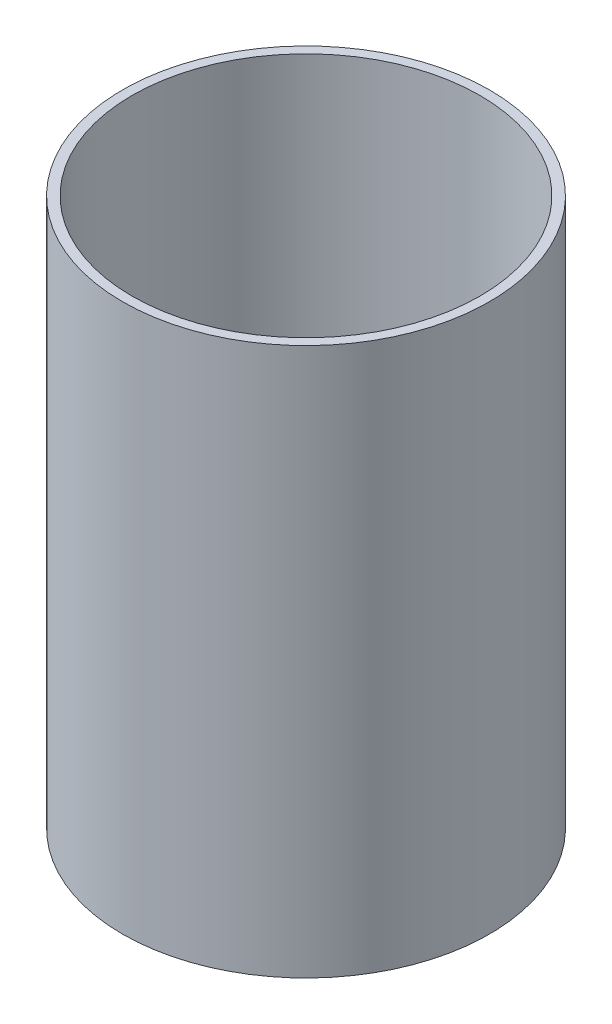
ISO-10303-21;
HEADER;
FILE_DESCRIPTION(('STEP AP214'),'2;1');
FILE_NAME('part.step','',(''),(''),'','','');
FILE_SCHEMA(('AUTOMOTIVE_DESIGN { 1 0 10303 214 1 1 1 1 }'));
ENDSEC;
DATA;
#1=APPLICATION_CONTEXT('core data for automotive mechanical design processes');
#2=APPLICATION_PROTOCOL_DEFINITION('international standard','automotive_design',2000,#1);
#3=PRODUCT_CONTEXT('',#1,'mechanical');
#4=PRODUCT('Part','Part','',(#3));
#5=PRODUCT_RELATED_PRODUCT_CATEGORY('part','',(#4));
#6=PRODUCT_DEFINITION_FORMATION('','',#4);
#7=PRODUCT_DEFINITION_CONTEXT('part definition',#1,'design');
#8=PRODUCT_DEFINITION('design','',#6,#7);
#9=PRODUCT_DEFINITION_SHAPE('','',#8);
#10=(LENGTH_UNIT() NAMED_UNIT(*) SI_UNIT(.MILLI.,.METRE.));
#11=(NAMED_UNIT(*) PLANE_ANGLE_UNIT() SI_UNIT($,.RADIAN.));
#12=(NAMED_UNIT(*) SI_UNIT($,.STERADIAN.) SOLID_ANGLE_UNIT());
#13=UNCERTAINTY_MEASURE_WITH_UNIT(LENGTH_MEASURE(1.E-05),#10,'distance_accuracy_value','');
#14=(GEOMETRIC_REPRESENTATION_CONTEXT(3) GLOBAL_UNCERTAINTY_ASSIGNED_CONTEXT((#13)) GLOBAL_UNIT_ASSIGNED_CONTEXT((#10,
#11,#12)) REPRESENTATION_CONTEXT('',''));
#15=CARTESIAN_POINT('',(0.,0.,0.));
#16=DIRECTION('',(0.,0.,1.));
#17=DIRECTION('',(1.,0.,0.));
#18=AXIS2_PLACEMENT_3D('',#15,#16,#17);
#19=CARTESIAN_POINT('',(0.,100.,0.));
#20=DIRECTION('',(0.,-1.,0.));
#21=DIRECTION('',(0.,0.,-1.));
#22=AXIS2_PLACEMENT_3D('',#19,#20,#21);
#23=CYLINDRICAL_SURFACE('',#22,33.5);
#24=CARTESIAN_POINT('',(0.,100.,0.));
#25=DIRECTION('',(0.,1.,0.));
#26=DIRECTION('',(0.,0.,1.));
#27=AXIS2_PLACEMENT_3D('',#24,#25,#26);
#28=CIRCLE('',#27,33.5);
#29=CARTESIAN_POINT('',(0.,100.,33.5));
#30=VERTEX_POINT('',#29);
#31=EDGE_CURVE('E10',#30,#30,#28,.T.);
#32=ORIENTED_EDGE('',*,*,#31,.F.);
#33=EDGE_LOOP('',(#32));
#34=FACE_BOUND('',#33,.T.);
#35=CARTESIAN_POINT('',(0.,0.,0.));
#36=DIRECTION('',(0.,1.,0.));
#37=DIRECTION('',(0.,0.,1.));
#38=AXIS2_PLACEMENT_3D('',#35,#36,#37);
#39=CIRCLE('',#38,33.5);
#40=CARTESIAN_POINT('',(0.,0.,33.5));
#41=VERTEX_POINT('',#40);
#42=EDGE_CURVE('E40',#41,#41,#39,.T.);
#43=ORIENTED_EDGE('',*,*,#42,.T.);
#44=EDGE_LOOP('',(#43));
#45=FACE_BOUND('',#44,.T.);
#46=ADVANCED_FACE('F37',(#34,#45),#23,.T.);
#47=CARTESIAN_POINT('',(0.,100.,0.));
#48=DIRECTION('',(0.,1.,0.));
#49=DIRECTION('',(0.,0.,1.));
#50=AXIS2_PLACEMENT_3D('',#47,#48,#49);
#51=PLANE('',#50);
#52=CARTESIAN_POINT('',(0.,100.,0.));
#53=DIRECTION('',(0.,1.,0.));
#54=DIRECTION('',(0.,0.,1.));
#55=AXIS2_PLACEMENT_3D('',#52,#53,#54);
#56=CIRCLE('',#55,31.75);
#57=CARTESIAN_POINT('',(0.,100.,31.75));
#58=VERTEX_POINT('',#57);
#59=EDGE_CURVE('E51',#58,#58,#56,.T.);
#60=ORIENTED_EDGE('',*,*,#59,.F.);
#61=EDGE_LOOP('',(#60));
#62=FACE_BOUND('',#61,.T.);
#63=ORIENTED_EDGE('',*,*,#31,.T.);
#64=EDGE_LOOP('',(#63));
#65=FACE_BOUND('',#64,.T.);
#66=ADVANCED_FACE('F68',(#62,#65),#51,.T.);
#67=CARTESIAN_POINT('',(0.,0.,0.));
#68=DIRECTION('',(0.,1.,0.));
#69=DIRECTION('',(0.,0.,1.));
#70=AXIS2_PLACEMENT_3D('',#67,#68,#69);
#71=PLANE('',#70);
#72=ORIENTED_EDGE('',*,*,#42,.F.);
#73=EDGE_LOOP('',(#72));
#74=FACE_BOUND('',#73,.T.);
#75=ADVANCED_FACE('F64',(#74),#71,.F.);
#76=CARTESIAN_POINT('',(0.,2.,0.));
#77=DIRECTION('',(0.,1.,0.));
#78=DIRECTION('',(0.,0.,1.));
#79=AXIS2_PLACEMENT_3D('',#76,#77,#78);
#80=CYLINDRICAL_SURFACE('',#79,31.75);
#81=CARTESIAN_POINT('',(0.,2.,0.));
#82=DIRECTION('',(0.,1.,0.));
#83=DIRECTION('',(0.,0.,1.));
#84=AXIS2_PLACEMENT_3D('',#81,#82,#83);
#85=CIRCLE('',#84,31.75);
#86=CARTESIAN_POINT('',(0.,2.,31.75));
#87=VERTEX_POINT('',#86);
#88=EDGE_CURVE('E49',#87,#87,#85,.T.);
#89=ORIENTED_EDGE('',*,*,#88,.F.);
#90=EDGE_LOOP('',(#89));
#91=FACE_BOUND('',#90,.T.);
#92=ORIENTED_EDGE('',*,*,#59,.T.);
#93=EDGE_LOOP('',(#92));
#94=FACE_BOUND('',#93,.T.);
#95=ADVANCED_FACE('F61',(#91,#94),#80,.F.);
#96=CARTESIAN_POINT('',(0.,2.,0.));
#97=DIRECTION('',(0.,1.,0.));
#98=DIRECTION('',(0.,0.,1.));
#99=AXIS2_PLACEMENT_3D('',#96,#97,#98);
#100=PLANE('',#99);
#101=ORIENTED_EDGE('',*,*,#88,.T.);
#102=EDGE_LOOP('',(#101));
#103=FACE_BOUND('',#102,.T.);
#104=ADVANCED_FACE('F59',(#103),#100,.T.);
#105=CLOSED_SHELL('',(#46,#66,#75,#95,#104));
#106=MANIFOLD_SOLID_BREP('B2',#105);
#107=ADVANCED_BREP_SHAPE_REPRESENTATION('',(#18,#106),#14);
#108=SHAPE_DEFINITION_REPRESENTATION(#9,#107);
ENDSEC;
END-ISO-10303-21;
